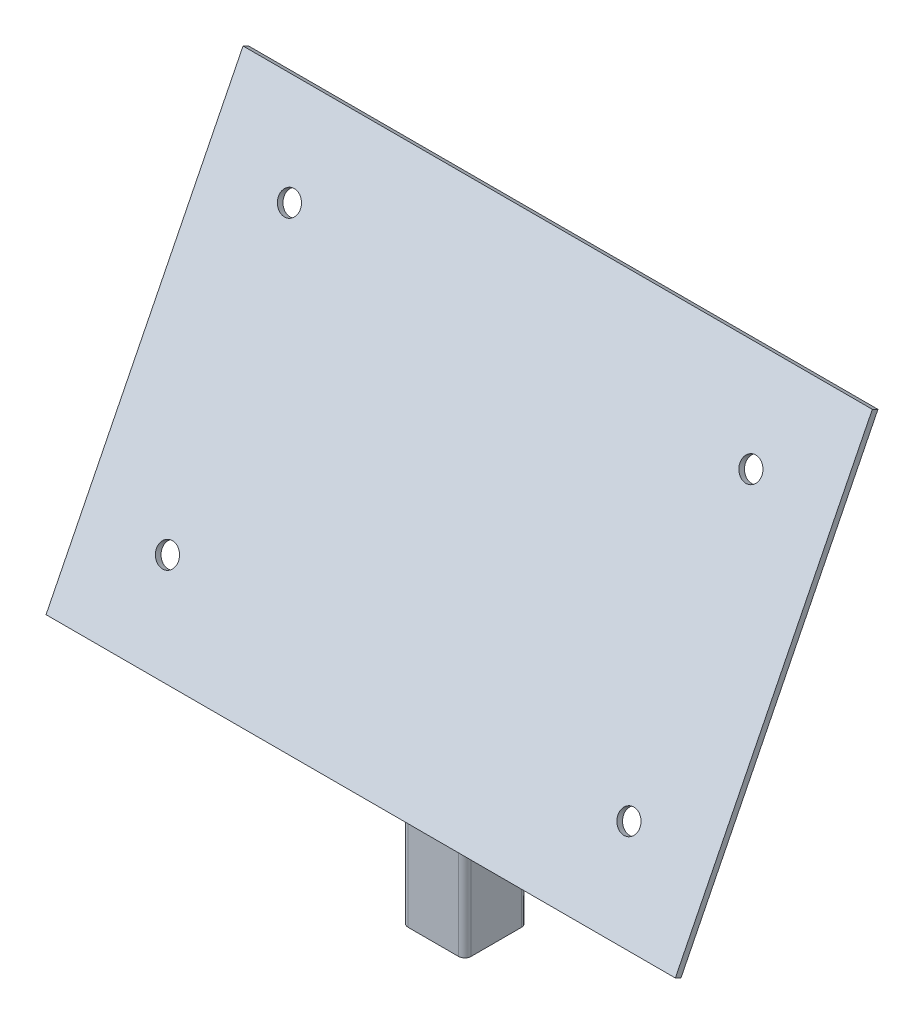
ISO-10303-21;
HEADER;
FILE_DESCRIPTION(('STEP AP214'),'2;1');
FILE_NAME('part.step','',(''),(''),'','','');
FILE_SCHEMA(('AUTOMOTIVE_DESIGN { 1 0 10303 214 1 1 1 1 }'));
ENDSEC;
DATA;
#1=APPLICATION_CONTEXT('core data for automotive mechanical design processes');
#2=APPLICATION_PROTOCOL_DEFINITION('international standard','automotive_design',2000,#1);
#3=PRODUCT_CONTEXT('',#1,'mechanical');
#4=PRODUCT('Part','Part','',(#3));
#5=PRODUCT_RELATED_PRODUCT_CATEGORY('part','',(#4));
#6=PRODUCT_DEFINITION_FORMATION('','',#4);
#7=PRODUCT_DEFINITION_CONTEXT('part definition',#1,'design');
#8=PRODUCT_DEFINITION('design','',#6,#7);
#9=PRODUCT_DEFINITION_SHAPE('','',#8);
#10=(LENGTH_UNIT() NAMED_UNIT(*) SI_UNIT(.MILLI.,.METRE.));
#11=(NAMED_UNIT(*) PLANE_ANGLE_UNIT() SI_UNIT($,.RADIAN.));
#12=(NAMED_UNIT(*) SI_UNIT($,.STERADIAN.) SOLID_ANGLE_UNIT());
#13=UNCERTAINTY_MEASURE_WITH_UNIT(LENGTH_MEASURE(1.E-05),#10,'distance_accuracy_value','');
#14=(GEOMETRIC_REPRESENTATION_CONTEXT(3) GLOBAL_UNCERTAINTY_ASSIGNED_CONTEXT((#13)) GLOBAL_UNIT_ASSIGNED_CONTEXT((#10,
#11,#12)) REPRESENTATION_CONTEXT('',''));
#15=CARTESIAN_POINT('',(0.,0.,0.));
#16=DIRECTION('',(0.,0.,1.));
#17=DIRECTION('',(1.,0.,0.));
#18=AXIS2_PLACEMENT_3D('',#15,#16,#17);
#19=CARTESIAN_POINT('',(12.,0.,12.));
#20=DIRECTION('',(0.,1.,0.));
#21=DIRECTION('',(0.,0.,1.));
#22=AXIS2_PLACEMENT_3D('',#19,#20,#21);
#23=PLANE('',#22);
#24=CARTESIAN_POINT('',(12.,0.,12.));
#25=DIRECTION('',(0.,1.,0.));
#26=DIRECTION('',(0.,0.,1.));
#27=AXIS2_PLACEMENT_3D('',#24,#25,#26);
#28=CIRCLE('',#27,3.);
#29=CARTESIAN_POINT('',(12.,0.,15.));
#30=VERTEX_POINT('',#29);
#31=CARTESIAN_POINT('',(15.,0.,12.));
#32=VERTEX_POINT('',#31);
#33=EDGE_CURVE('E276',#30,#32,#28,.T.);
#34=ORIENTED_EDGE('',*,*,#33,.F.);
#35=DIRECTION('',(1.,0.,0.));
#36=VECTOR('',#35,1.);
#37=CARTESIAN_POINT('',(-12.,0.,15.));
#38=LINE('',#37,#36);
#39=CARTESIAN_POINT('',(-12.,0.,15.));
#40=VERTEX_POINT('',#39);
#41=EDGE_CURVE('E281',#40,#30,#38,.T.);
#42=ORIENTED_EDGE('',*,*,#41,.F.);
#43=CARTESIAN_POINT('',(-12.,0.,12.));
#44=DIRECTION('',(0.,1.,0.));
#45=DIRECTION('',(0.,0.,-1.));
#46=AXIS2_PLACEMENT_3D('',#43,#44,#45);
#47=CIRCLE('',#46,3.);
#48=CARTESIAN_POINT('',(-15.,0.,12.));
#49=VERTEX_POINT('',#48);
#50=EDGE_CURVE('E297',#49,#40,#47,.T.);
#51=ORIENTED_EDGE('',*,*,#50,.F.);
#52=DIRECTION('',(0.,0.,1.));
#53=VECTOR('',#52,1.);
#54=CARTESIAN_POINT('',(-15.,0.,12.));
#55=LINE('',#54,#53);
#56=CARTESIAN_POINT('',(-15.,0.,-12.));
#57=VERTEX_POINT('',#56);
#58=EDGE_CURVE('E294',#57,#49,#55,.T.);
#59=ORIENTED_EDGE('',*,*,#58,.F.);
#60=CARTESIAN_POINT('',(-12.,0.,-12.));
#61=DIRECTION('',(0.,1.,0.));
#62=DIRECTION('',(0.,0.,-1.));
#63=AXIS2_PLACEMENT_3D('',#60,#61,#62);
#64=CIRCLE('',#63,3.);
#65=CARTESIAN_POINT('',(-12.,0.,-15.));
#66=VERTEX_POINT('',#65);
#67=EDGE_CURVE('E291',#66,#57,#64,.T.);
#68=ORIENTED_EDGE('',*,*,#67,.F.);
#69=DIRECTION('',(-1.,0.,0.));
#70=VECTOR('',#69,1.);
#71=CARTESIAN_POINT('',(-12.,0.,-15.));
#72=LINE('',#71,#70);
#73=CARTESIAN_POINT('',(12.,0.,-15.));
#74=VERTEX_POINT('',#73);
#75=EDGE_CURVE('E289',#74,#66,#72,.T.);
#76=ORIENTED_EDGE('',*,*,#75,.F.);
#77=CARTESIAN_POINT('',(12.,0.,-12.));
#78=DIRECTION('',(0.,1.,0.));
#79=DIRECTION('',(0.,0.,-1.));
#80=AXIS2_PLACEMENT_3D('',#77,#78,#79);
#81=CIRCLE('',#80,3.);
#82=CARTESIAN_POINT('',(15.,0.,-12.));
#83=VERTEX_POINT('',#82);
#84=EDGE_CURVE('E287',#83,#74,#81,.T.);
#85=ORIENTED_EDGE('',*,*,#84,.F.);
#86=DIRECTION('',(0.,0.,-1.));
#87=VECTOR('',#86,1.);
#88=CARTESIAN_POINT('',(15.,0.,12.));
#89=LINE('',#88,#87);
#90=EDGE_CURVE('E284',#32,#83,#89,.T.);
#91=ORIENTED_EDGE('',*,*,#90,.F.);
#92=EDGE_LOOP('',(#34,#42,#51,#59,#68,#76,#85,#91));
#93=FACE_BOUND('',#92,.T.);
#94=CARTESIAN_POINT('',(10.,0.,10.));
#95=DIRECTION('',(0.,1.,0.));
#96=DIRECTION('',(0.,0.,1.));
#97=AXIS2_PLACEMENT_3D('',#94,#95,#96);
#98=CIRCLE('',#97,3.);
#99=CARTESIAN_POINT('',(9.99999999999998,0.,13.));
#100=VERTEX_POINT('',#99);
#101=CARTESIAN_POINT('',(13.,0.,9.99999999999998));
#102=VERTEX_POINT('',#101);
#103=EDGE_CURVE('E236',#100,#102,#98,.T.);
#104=ORIENTED_EDGE('',*,*,#103,.T.);
#105=DIRECTION('',(0.,0.,-1.));
#106=VECTOR('',#105,1.);
#107=CARTESIAN_POINT('',(13.,0.,9.99999999999998));
#108=LINE('',#107,#106);
#109=CARTESIAN_POINT('',(13.,0.,-9.99999999999998));
#110=VERTEX_POINT('',#109);
#111=EDGE_CURVE('E239',#102,#110,#108,.T.);
#112=ORIENTED_EDGE('',*,*,#111,.T.);
#113=CARTESIAN_POINT('',(10.,0.,-10.));
#114=DIRECTION('',(0.,1.,0.));
#115=DIRECTION('',(0.,0.,-1.));
#116=AXIS2_PLACEMENT_3D('',#113,#114,#115);
#117=CIRCLE('',#116,3.);
#118=CARTESIAN_POINT('',(9.99999999999998,0.,-13.));
#119=VERTEX_POINT('',#118);
#120=EDGE_CURVE('E242',#110,#119,#117,.T.);
#121=ORIENTED_EDGE('',*,*,#120,.T.);
#122=DIRECTION('',(-1.,0.,0.));
#123=VECTOR('',#122,1.);
#124=CARTESIAN_POINT('',(-9.99999999999998,0.,-13.));
#125=LINE('',#124,#123);
#126=CARTESIAN_POINT('',(-10.,0.,-13.));
#127=VERTEX_POINT('',#126);
#128=EDGE_CURVE('E245',#119,#127,#125,.T.);
#129=ORIENTED_EDGE('',*,*,#128,.T.);
#130=CARTESIAN_POINT('',(-10.,0.,-10.));
#131=DIRECTION('',(0.,1.,0.));
#132=DIRECTION('',(0.,0.,-1.));
#133=AXIS2_PLACEMENT_3D('',#130,#131,#132);
#134=CIRCLE('',#133,3.);
#135=CARTESIAN_POINT('',(-13.,0.,-9.99999999999998));
#136=VERTEX_POINT('',#135);
#137=EDGE_CURVE('E248',#127,#136,#134,.T.);
#138=ORIENTED_EDGE('',*,*,#137,.T.);
#139=DIRECTION('',(0.,0.,1.));
#140=VECTOR('',#139,1.);
#141=CARTESIAN_POINT('',(-13.,0.,9.99999999999998));
#142=LINE('',#141,#140);
#143=CARTESIAN_POINT('',(-13.,0.,9.99999999999998));
#144=VERTEX_POINT('',#143);
#145=EDGE_CURVE('E251',#136,#144,#142,.T.);
#146=ORIENTED_EDGE('',*,*,#145,.T.);
#147=CARTESIAN_POINT('',(-10.,0.,10.));
#148=DIRECTION('',(0.,1.,0.));
#149=DIRECTION('',(0.,0.,-1.));
#150=AXIS2_PLACEMENT_3D('',#147,#148,#149);
#151=CIRCLE('',#150,3.);
#152=CARTESIAN_POINT('',(-9.99999999999998,0.,13.));
#153=VERTEX_POINT('',#152);
#154=EDGE_CURVE('E254',#144,#153,#151,.T.);
#155=ORIENTED_EDGE('',*,*,#154,.T.);
#156=DIRECTION('',(1.,0.,0.));
#157=VECTOR('',#156,1.);
#158=CARTESIAN_POINT('',(-9.99999999999998,0.,13.));
#159=LINE('',#158,#157);
#160=EDGE_CURVE('E257',#153,#100,#159,.T.);
#161=ORIENTED_EDGE('',*,*,#160,.T.);
#162=EDGE_LOOP('',(#104,#112,#121,#129,#138,#146,#155,#161));
#163=FACE_BOUND('',#162,.T.);
#164=ADVANCED_FACE('F33',(#93,#163),#23,.F.);
#165=CARTESIAN_POINT('',(12.,200.,12.));
#166=DIRECTION('',(0.,-1.,0.));
#167=DIRECTION('',(0.,0.,-1.));
#168=AXIS2_PLACEMENT_3D('',#165,#166,#167);
#169=CYLINDRICAL_SURFACE('',#168,3.);
#170=DIRECTION('',(0.,-1.,0.));
#171=VECTOR('',#170,1.);
#172=CARTESIAN_POINT('',(15.,200.,12.));
#173=LINE('',#172,#171);
#174=CARTESIAN_POINT('',(15.,146.,12.));
#175=VERTEX_POINT('',#174);
#176=EDGE_CURVE('E42',#175,#32,#173,.T.);
#177=ORIENTED_EDGE('',*,*,#176,.F.);
#178=CARTESIAN_POINT('',(12.,146.,12.));
#179=DIRECTION('',(0.,-0.447213595499958,-0.894427190999916));
#180=DIRECTION('',(0.,-0.894427190999916,0.447213595499958));
#181=AXIS2_PLACEMENT_3D('',#178,#179,#180);
#182=ELLIPSE('',#181,6.70820393249937,3.);
#183=CARTESIAN_POINT('',(12.,140.,15.));
#184=VERTEX_POINT('',#183);
#185=EDGE_CURVE('E233',#175,#184,#182,.T.);
#186=ORIENTED_EDGE('',*,*,#185,.T.);
#187=DIRECTION('',(0.,-1.,0.));
#188=VECTOR('',#187,1.);
#189=CARTESIAN_POINT('',(12.,200.,15.));
#190=LINE('',#189,#188);
#191=EDGE_CURVE('E280',#184,#30,#190,.T.);
#192=ORIENTED_EDGE('',*,*,#191,.T.);
#193=ORIENTED_EDGE('',*,*,#33,.T.);
#194=EDGE_LOOP('',(#177,#186,#192,#193));
#195=FACE_BOUND('',#194,.T.);
#196=ADVANCED_FACE('F35',(#195),#169,.T.);
#197=CARTESIAN_POINT('',(15.,200.,12.));
#198=DIRECTION('',(-1.,0.,0.));
#199=DIRECTION('',(0.,0.,1.));
#200=AXIS2_PLACEMENT_3D('',#197,#198,#199);
#201=PLANE('',#200);
#202=DIRECTION('',(0.,-1.,0.));
#203=VECTOR('',#202,1.);
#204=CARTESIAN_POINT('',(15.,200.,-12.));
#205=LINE('',#204,#203);
#206=CARTESIAN_POINT('',(15.,194.,-12.));
#207=VERTEX_POINT('',#206);
#208=EDGE_CURVE('E315',#207,#83,#205,.T.);
#209=ORIENTED_EDGE('',*,*,#208,.F.);
#210=DIRECTION('',(0.,0.894427190999916,-0.447213595499958));
#211=VECTOR('',#210,1.);
#212=CARTESIAN_POINT('',(15.,200.,-15.));
#213=LINE('',#212,#211);
#214=EDGE_CURVE('E195',#175,#207,#213,.T.);
#215=ORIENTED_EDGE('',*,*,#214,.F.);
#216=ORIENTED_EDGE('',*,*,#176,.T.);
#217=ORIENTED_EDGE('',*,*,#90,.T.);
#218=EDGE_LOOP('',(#209,#215,#216,#217));
#219=FACE_BOUND('',#218,.T.);
#220=ADVANCED_FACE('F375',(#219),#201,.F.);
#221=CARTESIAN_POINT('',(12.,200.,-12.));
#222=DIRECTION('',(0.,-1.,0.));
#223=DIRECTION('',(0.,0.,-1.));
#224=AXIS2_PLACEMENT_3D('',#221,#222,#223);
#225=CYLINDRICAL_SURFACE('',#224,3.);
#226=DIRECTION('',(0.,-1.,0.));
#227=VECTOR('',#226,1.);
#228=CARTESIAN_POINT('',(12.,200.,-15.));
#229=LINE('',#228,#227);
#230=CARTESIAN_POINT('',(12.,200.,-15.));
#231=VERTEX_POINT('',#230);
#232=EDGE_CURVE('E312',#231,#74,#229,.T.);
#233=ORIENTED_EDGE('',*,*,#232,.F.);
#234=CARTESIAN_POINT('',(12.,194.,-12.));
#235=DIRECTION('',(0.,-0.447213595499958,-0.894427190999916));
#236=DIRECTION('',(0.,-0.894427190999916,0.447213595499958));
#237=AXIS2_PLACEMENT_3D('',#234,#235,#236);
#238=ELLIPSE('',#237,6.70820393249937,3.);
#239=EDGE_CURVE('E231',#231,#207,#238,.T.);
#240=ORIENTED_EDGE('',*,*,#239,.T.);
#241=ORIENTED_EDGE('',*,*,#208,.T.);
#242=ORIENTED_EDGE('',*,*,#84,.T.);
#243=EDGE_LOOP('',(#233,#240,#241,#242));
#244=FACE_BOUND('',#243,.T.);
#245=ADVANCED_FACE('F401',(#244),#225,.T.);
#246=CARTESIAN_POINT('',(-12.,200.,-15.));
#247=DIRECTION('',(0.,0.,1.));
#248=DIRECTION('',(1.,0.,0.));
#249=AXIS2_PLACEMENT_3D('',#246,#247,#248);
#250=PLANE('',#249);
#251=ORIENTED_EDGE('',*,*,#75,.T.);
#252=DIRECTION('',(0.,-1.,0.));
#253=VECTOR('',#252,1.);
#254=CARTESIAN_POINT('',(-12.,200.,-15.));
#255=LINE('',#254,#253);
#256=CARTESIAN_POINT('',(-12.,200.,-15.));
#257=VERTEX_POINT('',#256);
#258=EDGE_CURVE('E309',#257,#66,#255,.T.);
#259=ORIENTED_EDGE('',*,*,#258,.F.);
#260=DIRECTION('',(-1.,0.,0.));
#261=VECTOR('',#260,1.);
#262=CARTESIAN_POINT('',(-12.,200.,-15.));
#263=LINE('',#262,#261);
#264=EDGE_CURVE('E277',#231,#257,#263,.T.);
#265=ORIENTED_EDGE('',*,*,#264,.F.);
#266=ORIENTED_EDGE('',*,*,#232,.T.);
#267=EDGE_LOOP('',(#251,#259,#265,#266));
#268=FACE_BOUND('',#267,.T.);
#269=ADVANCED_FACE('F397',(#268),#250,.F.);
#270=CARTESIAN_POINT('',(-12.,200.,-12.));
#271=DIRECTION('',(0.,-1.,0.));
#272=DIRECTION('',(0.,0.,-1.));
#273=AXIS2_PLACEMENT_3D('',#270,#271,#272);
#274=CYLINDRICAL_SURFACE('',#273,3.);
#275=DIRECTION('',(0.,-1.,0.));
#276=VECTOR('',#275,1.);
#277=CARTESIAN_POINT('',(-15.,200.,-12.));
#278=LINE('',#277,#276);
#279=CARTESIAN_POINT('',(-15.,194.,-12.));
#280=VERTEX_POINT('',#279);
#281=EDGE_CURVE('E307',#280,#57,#278,.T.);
#282=ORIENTED_EDGE('',*,*,#281,.F.);
#283=CARTESIAN_POINT('',(-12.,194.,-12.));
#284=DIRECTION('',(0.,-0.447213595499958,-0.894427190999916));
#285=DIRECTION('',(0.,-0.894427190999916,0.447213595499958));
#286=AXIS2_PLACEMENT_3D('',#283,#284,#285);
#287=ELLIPSE('',#286,6.70820393249937,3.);
#288=EDGE_CURVE('E229',#280,#257,#287,.T.);
#289=ORIENTED_EDGE('',*,*,#288,.T.);
#290=ORIENTED_EDGE('',*,*,#258,.T.);
#291=ORIENTED_EDGE('',*,*,#67,.T.);
#292=EDGE_LOOP('',(#282,#289,#290,#291));
#293=FACE_BOUND('',#292,.T.);
#294=ADVANCED_FACE('F393',(#293),#274,.T.);
#295=CARTESIAN_POINT('',(-15.,200.,12.));
#296=DIRECTION('',(1.,0.,0.));
#297=DIRECTION('',(0.,0.,-1.));
#298=AXIS2_PLACEMENT_3D('',#295,#296,#297);
#299=PLANE('',#298);
#300=DIRECTION('',(0.,-1.,0.));
#301=VECTOR('',#300,1.);
#302=CARTESIAN_POINT('',(-15.,200.,12.));
#303=LINE('',#302,#301);
#304=CARTESIAN_POINT('',(-15.,146.,12.));
#305=VERTEX_POINT('',#304);
#306=EDGE_CURVE('E305',#305,#49,#303,.T.);
#307=ORIENTED_EDGE('',*,*,#306,.F.);
#308=DIRECTION('',(0.,0.894427190999916,-0.447213595499958));
#309=VECTOR('',#308,1.);
#310=CARTESIAN_POINT('',(-15.,189.2,-9.6));
#311=LINE('',#310,#309);
#312=EDGE_CURVE('E227',#305,#280,#311,.T.);
#313=ORIENTED_EDGE('',*,*,#312,.T.);
#314=ORIENTED_EDGE('',*,*,#281,.T.);
#315=ORIENTED_EDGE('',*,*,#58,.T.);
#316=EDGE_LOOP('',(#307,#313,#314,#315));
#317=FACE_BOUND('',#316,.T.);
#318=ADVANCED_FACE('F389',(#317),#299,.F.);
#319=CARTESIAN_POINT('',(-12.,200.,12.));
#320=DIRECTION('',(0.,-1.,0.));
#321=DIRECTION('',(0.,0.,-1.));
#322=AXIS2_PLACEMENT_3D('',#319,#320,#321);
#323=CYLINDRICAL_SURFACE('',#322,3.);
#324=DIRECTION('',(0.,-1.,0.));
#325=VECTOR('',#324,1.);
#326=CARTESIAN_POINT('',(-12.,200.,15.));
#327=LINE('',#326,#325);
#328=CARTESIAN_POINT('',(-12.,140.,15.));
#329=VERTEX_POINT('',#328);
#330=EDGE_CURVE('E303',#329,#40,#327,.T.);
#331=ORIENTED_EDGE('',*,*,#330,.F.);
#332=CARTESIAN_POINT('',(-12.,146.,12.));
#333=DIRECTION('',(0.,-0.447213595499958,-0.894427190999916));
#334=DIRECTION('',(0.,-0.894427190999916,0.447213595499958));
#335=AXIS2_PLACEMENT_3D('',#332,#333,#334);
#336=ELLIPSE('',#335,6.70820393249937,3.);
#337=EDGE_CURVE('E225',#329,#305,#336,.T.);
#338=ORIENTED_EDGE('',*,*,#337,.T.);
#339=ORIENTED_EDGE('',*,*,#306,.T.);
#340=ORIENTED_EDGE('',*,*,#50,.T.);
#341=EDGE_LOOP('',(#331,#338,#339,#340));
#342=FACE_BOUND('',#341,.T.);
#343=ADVANCED_FACE('F386',(#342),#323,.T.);
#344=CARTESIAN_POINT('',(-12.,200.,15.));
#345=DIRECTION('',(0.,0.,-1.));
#346=DIRECTION('',(-1.,0.,0.));
#347=AXIS2_PLACEMENT_3D('',#344,#345,#346);
#348=PLANE('',#347);
#349=ORIENTED_EDGE('',*,*,#191,.F.);
#350=DIRECTION('',(1.,0.,0.));
#351=VECTOR('',#350,1.);
#352=CARTESIAN_POINT('',(-85.,140.,15.));
#353=LINE('',#352,#351);
#354=EDGE_CURVE('E50',#329,#184,#353,.T.);
#355=ORIENTED_EDGE('',*,*,#354,.F.);
#356=ORIENTED_EDGE('',*,*,#330,.T.);
#357=ORIENTED_EDGE('',*,*,#41,.T.);
#358=EDGE_LOOP('',(#349,#355,#356,#357));
#359=FACE_BOUND('',#358,.T.);
#360=ADVANCED_FACE('F383',(#359),#348,.F.);
#361=CARTESIAN_POINT('',(10.,200.,10.));
#362=DIRECTION('',(0.,-1.,0.));
#363=DIRECTION('',(0.,0.,-1.));
#364=AXIS2_PLACEMENT_3D('',#361,#362,#363);
#365=CYLINDRICAL_SURFACE('',#364,3.);
#366=CARTESIAN_POINT('',(10.,150.,10.));
#367=DIRECTION('',(0.,-0.447213595499958,-0.894427190999916));
#368=DIRECTION('',(0.,-0.894427190999916,0.447213595499958));
#369=AXIS2_PLACEMENT_3D('',#366,#367,#368);
#370=ELLIPSE('',#369,6.70820393249937,3.);
#371=CARTESIAN_POINT('',(13.,150.,9.99999999999998));
#372=VERTEX_POINT('',#371);
#373=CARTESIAN_POINT('',(9.99999999999998,144.,13.));
#374=VERTEX_POINT('',#373);
#375=EDGE_CURVE('E222',#372,#374,#370,.T.);
#376=ORIENTED_EDGE('',*,*,#375,.F.);
#377=DIRECTION('',(0.,-1.,0.));
#378=VECTOR('',#377,1.);
#379=CARTESIAN_POINT('',(13.,200.,9.99999999999998));
#380=LINE('',#379,#378);
#381=EDGE_CURVE('E274',#372,#102,#380,.T.);
#382=ORIENTED_EDGE('',*,*,#381,.T.);
#383=ORIENTED_EDGE('',*,*,#103,.F.);
#384=DIRECTION('',(0.,-1.,0.));
#385=VECTOR('',#384,1.);
#386=CARTESIAN_POINT('',(9.99999999999998,200.,13.));
#387=LINE('',#386,#385);
#388=EDGE_CURVE('E260',#374,#100,#387,.T.);
#389=ORIENTED_EDGE('',*,*,#388,.F.);
#390=EDGE_LOOP('',(#376,#382,#383,#389));
#391=FACE_BOUND('',#390,.T.);
#392=ADVANCED_FACE('F381',(#391),#365,.F.);
#393=CARTESIAN_POINT('',(13.,200.,9.99999999999998));
#394=DIRECTION('',(-1.,0.,0.));
#395=DIRECTION('',(0.,0.,1.));
#396=AXIS2_PLACEMENT_3D('',#393,#394,#395);
#397=PLANE('',#396);
#398=DIRECTION('',(0.,-0.894427190999916,0.447213595499958));
#399=VECTOR('',#398,1.);
#400=CARTESIAN_POINT('',(13.,190.,-10.));
#401=LINE('',#400,#399);
#402=CARTESIAN_POINT('',(13.,190.,-9.99999999999998));
#403=VERTEX_POINT('',#402);
#404=EDGE_CURVE('E219',#403,#372,#401,.T.);
#405=ORIENTED_EDGE('',*,*,#404,.F.);
#406=DIRECTION('',(0.,-1.,0.));
#407=VECTOR('',#406,1.);
#408=CARTESIAN_POINT('',(13.,200.,-9.99999999999998));
#409=LINE('',#408,#407);
#410=EDGE_CURVE('E272',#403,#110,#409,.T.);
#411=ORIENTED_EDGE('',*,*,#410,.T.);
#412=ORIENTED_EDGE('',*,*,#111,.F.);
#413=ORIENTED_EDGE('',*,*,#381,.F.);
#414=EDGE_LOOP('',(#405,#411,#412,#413));
#415=FACE_BOUND('',#414,.T.);
#416=ADVANCED_FACE('F571',(#415),#397,.T.);
#417=CARTESIAN_POINT('',(10.,200.,-10.));
#418=DIRECTION('',(0.,-1.,0.));
#419=DIRECTION('',(0.,0.,-1.));
#420=AXIS2_PLACEMENT_3D('',#417,#418,#419);
#421=CYLINDRICAL_SURFACE('',#420,3.);
#422=CARTESIAN_POINT('',(10.,190.,-10.));
#423=DIRECTION('',(0.,-0.447213595499958,-0.894427190999916));
#424=DIRECTION('',(0.,-0.894427190999916,0.447213595499958));
#425=AXIS2_PLACEMENT_3D('',#422,#423,#424);
#426=ELLIPSE('',#425,6.70820393249937,3.);
#427=CARTESIAN_POINT('',(9.99999999999997,196.,-13.));
#428=VERTEX_POINT('',#427);
#429=EDGE_CURVE('E216',#428,#403,#426,.T.);
#430=ORIENTED_EDGE('',*,*,#429,.F.);
#431=DIRECTION('',(0.,-1.,0.));
#432=VECTOR('',#431,1.);
#433=CARTESIAN_POINT('',(9.99999999999998,200.,-13.));
#434=LINE('',#433,#432);
#435=EDGE_CURVE('E270',#428,#119,#434,.T.);
#436=ORIENTED_EDGE('',*,*,#435,.T.);
#437=ORIENTED_EDGE('',*,*,#120,.F.);
#438=ORIENTED_EDGE('',*,*,#410,.F.);
#439=EDGE_LOOP('',(#430,#436,#437,#438));
#440=FACE_BOUND('',#439,.T.);
#441=ADVANCED_FACE('F562',(#440),#421,.F.);
#442=CARTESIAN_POINT('',(-9.99999999999998,200.,-13.));
#443=DIRECTION('',(0.,0.,1.));
#444=DIRECTION('',(1.,0.,0.));
#445=AXIS2_PLACEMENT_3D('',#442,#443,#444);
#446=PLANE('',#445);
#447=DIRECTION('',(1.,0.,0.));
#448=VECTOR('',#447,1.);
#449=CARTESIAN_POINT('',(-9.99999999999998,196.,-13.));
#450=LINE('',#449,#448);
#451=CARTESIAN_POINT('',(-10.,196.,-13.));
#452=VERTEX_POINT('',#451);
#453=EDGE_CURVE('E213',#452,#428,#450,.T.);
#454=ORIENTED_EDGE('',*,*,#453,.F.);
#455=DIRECTION('',(0.,-1.,0.));
#456=VECTOR('',#455,1.);
#457=CARTESIAN_POINT('',(-10.,200.,-13.));
#458=LINE('',#457,#456);
#459=EDGE_CURVE('E268',#452,#127,#458,.T.);
#460=ORIENTED_EDGE('',*,*,#459,.T.);
#461=ORIENTED_EDGE('',*,*,#128,.F.);
#462=ORIENTED_EDGE('',*,*,#435,.F.);
#463=EDGE_LOOP('',(#454,#460,#461,#462));
#464=FACE_BOUND('',#463,.T.);
#465=ADVANCED_FACE('F553',(#464),#446,.T.);
#466=CARTESIAN_POINT('',(-10.,200.,-10.));
#467=DIRECTION('',(0.,-1.,0.));
#468=DIRECTION('',(0.,0.,-1.));
#469=AXIS2_PLACEMENT_3D('',#466,#467,#468);
#470=CYLINDRICAL_SURFACE('',#469,3.);
#471=CARTESIAN_POINT('',(-10.,190.,-10.));
#472=DIRECTION('',(0.,-0.447213595499958,-0.894427190999916));
#473=DIRECTION('',(0.,-0.894427190999916,0.447213595499958));
#474=AXIS2_PLACEMENT_3D('',#471,#472,#473);
#475=ELLIPSE('',#474,6.70820393249937,3.);
#476=CARTESIAN_POINT('',(-13.,190.,-9.99999999999998));
#477=VERTEX_POINT('',#476);
#478=EDGE_CURVE('E210',#477,#452,#475,.T.);
#479=ORIENTED_EDGE('',*,*,#478,.F.);
#480=DIRECTION('',(0.,-1.,0.));
#481=VECTOR('',#480,1.);
#482=CARTESIAN_POINT('',(-13.,200.,-9.99999999999998));
#483=LINE('',#482,#481);
#484=EDGE_CURVE('E266',#477,#136,#483,.T.);
#485=ORIENTED_EDGE('',*,*,#484,.T.);
#486=ORIENTED_EDGE('',*,*,#137,.F.);
#487=ORIENTED_EDGE('',*,*,#459,.F.);
#488=EDGE_LOOP('',(#479,#485,#486,#487));
#489=FACE_BOUND('',#488,.T.);
#490=ADVANCED_FACE('F544',(#489),#470,.F.);
#491=CARTESIAN_POINT('',(-13.,200.,9.99999999999998));
#492=DIRECTION('',(1.,0.,0.));
#493=DIRECTION('',(0.,0.,-1.));
#494=AXIS2_PLACEMENT_3D('',#491,#492,#493);
#495=PLANE('',#494);
#496=DIRECTION('',(0.,0.894427190999916,-0.447213595499958));
#497=VECTOR('',#496,1.);
#498=CARTESIAN_POINT('',(-13.,190.,-10.));
#499=LINE('',#498,#497);
#500=CARTESIAN_POINT('',(-13.,150.,9.99999999999998));
#501=VERTEX_POINT('',#500);
#502=EDGE_CURVE('E207',#501,#477,#499,.T.);
#503=ORIENTED_EDGE('',*,*,#502,.F.);
#504=DIRECTION('',(0.,-1.,0.));
#505=VECTOR('',#504,1.);
#506=CARTESIAN_POINT('',(-13.,200.,9.99999999999998));
#507=LINE('',#506,#505);
#508=EDGE_CURVE('E264',#501,#144,#507,.T.);
#509=ORIENTED_EDGE('',*,*,#508,.T.);
#510=ORIENTED_EDGE('',*,*,#145,.F.);
#511=ORIENTED_EDGE('',*,*,#484,.F.);
#512=EDGE_LOOP('',(#503,#509,#510,#511));
#513=FACE_BOUND('',#512,.T.);
#514=ADVANCED_FACE('F535',(#513),#495,.T.);
#515=CARTESIAN_POINT('',(-10.,200.,10.));
#516=DIRECTION('',(0.,-1.,0.));
#517=DIRECTION('',(0.,0.,-1.));
#518=AXIS2_PLACEMENT_3D('',#515,#516,#517);
#519=CYLINDRICAL_SURFACE('',#518,3.);
#520=CARTESIAN_POINT('',(-10.,150.,10.));
#521=DIRECTION('',(0.,-0.447213595499958,-0.894427190999916));
#522=DIRECTION('',(0.,-0.894427190999916,0.447213595499958));
#523=AXIS2_PLACEMENT_3D('',#520,#521,#522);
#524=ELLIPSE('',#523,6.70820393249937,3.);
#525=CARTESIAN_POINT('',(-9.99999999999998,144.,13.));
#526=VERTEX_POINT('',#525);
#527=EDGE_CURVE('E204',#526,#501,#524,.T.);
#528=ORIENTED_EDGE('',*,*,#527,.F.);
#529=DIRECTION('',(0.,-1.,0.));
#530=VECTOR('',#529,1.);
#531=CARTESIAN_POINT('',(-9.99999999999998,200.,13.));
#532=LINE('',#531,#530);
#533=EDGE_CURVE('E262',#526,#153,#532,.T.);
#534=ORIENTED_EDGE('',*,*,#533,.T.);
#535=ORIENTED_EDGE('',*,*,#154,.F.);
#536=ORIENTED_EDGE('',*,*,#508,.F.);
#537=EDGE_LOOP('',(#528,#534,#535,#536));
#538=FACE_BOUND('',#537,.T.);
#539=ADVANCED_FACE('F527',(#538),#519,.F.);
#540=CARTESIAN_POINT('',(-9.99999999999998,200.,13.));
#541=DIRECTION('',(0.,0.,-1.));
#542=DIRECTION('',(-1.,0.,0.));
#543=AXIS2_PLACEMENT_3D('',#540,#541,#542);
#544=PLANE('',#543);
#545=DIRECTION('',(-1.,0.,0.));
#546=VECTOR('',#545,1.);
#547=CARTESIAN_POINT('',(-9.99999999999998,144.,13.));
#548=LINE('',#547,#546);
#549=EDGE_CURVE('E11',#374,#526,#548,.T.);
#550=ORIENTED_EDGE('',*,*,#549,.F.);
#551=ORIENTED_EDGE('',*,*,#388,.T.);
#552=ORIENTED_EDGE('',*,*,#160,.F.);
#553=ORIENTED_EDGE('',*,*,#533,.F.);
#554=EDGE_LOOP('',(#550,#551,#552,#553));
#555=FACE_BOUND('',#554,.T.);
#556=ADVANCED_FACE('F436',(#555),#544,.T.);
#557=CARTESIAN_POINT('',(0.,34.,68.));
#558=DIRECTION('',(0.,-0.447213595499958,-0.894427190999916));
#559=DIRECTION('',(0.,0.894427190999916,-0.447213595499958));
#560=AXIS2_PLACEMENT_3D('',#557,#558,#559);
#561=PLANE('',#560);
#562=ORIENTED_EDGE('',*,*,#404,.T.);
#563=ORIENTED_EDGE('',*,*,#375,.T.);
#564=ORIENTED_EDGE('',*,*,#549,.T.);
#565=ORIENTED_EDGE('',*,*,#527,.T.);
#566=ORIENTED_EDGE('',*,*,#502,.T.);
#567=ORIENTED_EDGE('',*,*,#478,.T.);
#568=ORIENTED_EDGE('',*,*,#453,.T.);
#569=ORIENTED_EDGE('',*,*,#429,.T.);
#570=EDGE_LOOP('',(#562,#563,#564,#565,#566,#567,#568,#569));
#571=FACE_BOUND('',#570,.T.);
#572=ADVANCED_FACE('F428',(#571),#561,.T.);
#573=CARTESIAN_POINT('',(-110.,111.862232585006,29.0688837074972));
#574=DIRECTION('',(0.,-0.447213595499958,-0.894427190999916));
#575=DIRECTION('',(0.,0.894427190999916,-0.447213595499958));
#576=AXIS2_PLACEMENT_3D('',#573,#574,#575);
#577=CIRCLE('',#576,5.25);
#578=CARTESIAN_POINT('',(-110.,116.557975337755,26.7210123311225));
#579=VERTEX_POINT('',#578);
#580=EDGE_CURVE('E338',#579,#579,#577,.F.);
#581=ORIENTED_EDGE('',*,*,#580,.T.);
#582=EDGE_LOOP('',(#581));
#583=FACE_BOUND('',#582,.T.);
#584=CARTESIAN_POINT('',(110.,111.862232585006,29.0688837074972));
#585=DIRECTION('',(0.,-0.447213595499958,-0.894427190999916));
#586=DIRECTION('',(0.,0.894427190999916,-0.447213595499958));
#587=AXIS2_PLACEMENT_3D('',#584,#585,#586);
#588=CIRCLE('',#587,5.25);
#589=CARTESIAN_POINT('',(110.,116.557975337755,26.7210123311225));
#590=VERTEX_POINT('',#589);
#591=EDGE_CURVE('E327',#590,#590,#588,.F.);
#592=ORIENTED_EDGE('',*,*,#591,.T.);
#593=EDGE_LOOP('',(#592));
#594=FACE_BOUND('',#593,.T.);
#595=CARTESIAN_POINT('',(110.,228.137767414995,-29.0688837074973));
#596=DIRECTION('',(0.,-0.447213595499958,-0.894427190999916));
#597=DIRECTION('',(0.,0.894427190999916,-0.447213595499958));
#598=AXIS2_PLACEMENT_3D('',#595,#596,#597);
#599=CIRCLE('',#598,5.25000000000001);
#600=CARTESIAN_POINT('',(110.,232.833510167744,-31.4167550838721));
#601=VERTEX_POINT('',#600);
#602=EDGE_CURVE('E324',#601,#601,#599,.F.);
#603=ORIENTED_EDGE('',*,*,#602,.T.);
#604=EDGE_LOOP('',(#603));
#605=FACE_BOUND('',#604,.T.);
#606=CARTESIAN_POINT('',(-110.,228.137767414995,-29.0688837074973));
#607=DIRECTION('',(0.,-0.447213595499958,-0.894427190999916));
#608=DIRECTION('',(0.,0.894427190999916,-0.447213595499958));
#609=AXIS2_PLACEMENT_3D('',#606,#607,#608);
#610=CIRCLE('',#609,5.25000000000001);
#611=CARTESIAN_POINT('',(-110.,232.833510167744,-31.4167550838721));
#612=VERTEX_POINT('',#611);
#613=EDGE_CURVE('E321',#612,#612,#610,.F.);
#614=ORIENTED_EDGE('',*,*,#613,.T.);
#615=EDGE_LOOP('',(#614));
#616=FACE_BOUND('',#615,.T.);
#617=DIRECTION('',(0.,0.894427190999916,-0.447213595499958));
#618=VECTOR('',#617,1.);
#619=CARTESIAN_POINT('',(150.,76.0851449450088,46.9574275274956));
#620=LINE('',#619,#618);
#621=CARTESIAN_POINT('',(150.,76.0851449450088,46.9574275274956));
#622=VERTEX_POINT('',#621);
#623=CARTESIAN_POINT('',(150.,263.914855054991,-46.9574275274956));
#624=VERTEX_POINT('',#623);
#625=EDGE_CURVE('E194',#622,#624,#620,.T.);
#626=ORIENTED_EDGE('',*,*,#625,.F.);
#627=DIRECTION('',(1.,0.,0.));
#628=VECTOR('',#627,1.);
#629=CARTESIAN_POINT('',(-150.,76.0851449450088,46.9574275274956));
#630=LINE('',#629,#628);
#631=CARTESIAN_POINT('',(-150.,76.0851449450088,46.9574275274956));
#632=VERTEX_POINT('',#631);
#633=EDGE_CURVE('E190',#632,#622,#630,.T.);
#634=ORIENTED_EDGE('',*,*,#633,.F.);
#635=DIRECTION('',(0.,-0.894427190999916,0.447213595499958));
#636=VECTOR('',#635,1.);
#637=CARTESIAN_POINT('',(-150.,76.0851449450088,46.9574275274956));
#638=LINE('',#637,#636);
#639=CARTESIAN_POINT('',(-150.,263.914855054991,-46.9574275274956));
#640=VERTEX_POINT('',#639);
#641=EDGE_CURVE('E347',#640,#632,#638,.T.);
#642=ORIENTED_EDGE('',*,*,#641,.F.);
#643=DIRECTION('',(-1.,0.,0.));
#644=VECTOR('',#643,1.);
#645=CARTESIAN_POINT('',(-150.,263.914855054991,-46.9574275274956));
#646=LINE('',#645,#644);
#647=EDGE_CURVE('E345',#624,#640,#646,.T.);
#648=ORIENTED_EDGE('',*,*,#647,.F.);
#649=EDGE_LOOP('',(#626,#634,#642,#648));
#650=FACE_BOUND('',#649,.T.);
#651=ORIENTED_EDGE('',*,*,#185,.F.);
#652=ORIENTED_EDGE('',*,*,#214,.T.);
#653=ORIENTED_EDGE('',*,*,#239,.F.);
#654=ORIENTED_EDGE('',*,*,#264,.T.);
#655=ORIENTED_EDGE('',*,*,#288,.F.);
#656=ORIENTED_EDGE('',*,*,#312,.F.);
#657=ORIENTED_EDGE('',*,*,#337,.F.);
#658=ORIENTED_EDGE('',*,*,#354,.T.);
#659=EDGE_LOOP('',(#651,#652,#653,#654,#655,#656,#657,#658));
#660=FACE_BOUND('',#659,.T.);
#661=ADVANCED_FACE('F358',(#583,#594,#605,#616,#650,#660),#561,.T.);
#662=CARTESIAN_POINT('',(150.,77.4267857315087,49.6407091004953));
#663=DIRECTION('',(-1.,0.,0.));
#664=DIRECTION('',(0.,0.,1.));
#665=AXIS2_PLACEMENT_3D('',#662,#663,#664);
#666=PLANE('',#665);
#667=ORIENTED_EDGE('',*,*,#625,.T.);
#668=DIRECTION('',(0.,-0.447213595499958,-0.894427190999916));
#669=VECTOR('',#668,1.);
#670=CARTESIAN_POINT('',(150.,265.256495841491,-44.2741459544959));
#671=LINE('',#670,#669);
#672=CARTESIAN_POINT('',(150.,265.256495841491,-44.2741459544959));
#673=VERTEX_POINT('',#672);
#674=EDGE_CURVE('E174',#673,#624,#671,.T.);
#675=ORIENTED_EDGE('',*,*,#674,.F.);
#676=DIRECTION('',(0.,0.894427190999916,-0.447213595499958));
#677=VECTOR('',#676,1.);
#678=CARTESIAN_POINT('',(150.,77.4267857315087,49.6407091004953));
#679=LINE('',#678,#677);
#680=CARTESIAN_POINT('',(150.,77.4267857315087,49.6407091004953));
#681=VERTEX_POINT('',#680);
#682=EDGE_CURVE('E181',#681,#673,#679,.T.);
#683=ORIENTED_EDGE('',*,*,#682,.F.);
#684=DIRECTION('',(0.,-0.447213595499958,-0.894427190999916));
#685=VECTOR('',#684,1.);
#686=CARTESIAN_POINT('',(150.,77.4267857315087,49.6407091004953));
#687=LINE('',#686,#685);
#688=EDGE_CURVE('E343',#681,#622,#687,.T.);
#689=ORIENTED_EDGE('',*,*,#688,.T.);
#690=EDGE_LOOP('',(#667,#675,#683,#689));
#691=FACE_BOUND('',#690,.T.);
#692=ADVANCED_FACE('F192',(#691),#666,.F.);
#693=CARTESIAN_POINT('',(-150.,265.256495841491,-44.2741459544959));
#694=DIRECTION('',(0.,-0.894427190999916,0.447213595499958));
#695=DIRECTION('',(0.,-0.447213595499958,-0.894427190999916));
#696=AXIS2_PLACEMENT_3D('',#693,#694,#695);
#697=PLANE('',#696);
#698=ORIENTED_EDGE('',*,*,#647,.T.);
#699=DIRECTION('',(0.,-0.447213595499958,-0.894427190999916));
#700=VECTOR('',#699,1.);
#701=CARTESIAN_POINT('',(-150.,265.256495841491,-44.2741459544959));
#702=LINE('',#701,#700);
#703=CARTESIAN_POINT('',(-150.,265.256495841491,-44.2741459544959));
#704=VERTEX_POINT('',#703);
#705=EDGE_CURVE('E177',#704,#640,#702,.T.);
#706=ORIENTED_EDGE('',*,*,#705,.F.);
#707=DIRECTION('',(-1.,0.,0.));
#708=VECTOR('',#707,1.);
#709=CARTESIAN_POINT('',(-150.,265.256495841491,-44.2741459544959));
#710=LINE('',#709,#708);
#711=EDGE_CURVE('E170',#673,#704,#710,.T.);
#712=ORIENTED_EDGE('',*,*,#711,.F.);
#713=ORIENTED_EDGE('',*,*,#674,.T.);
#714=EDGE_LOOP('',(#698,#706,#712,#713));
#715=FACE_BOUND('',#714,.T.);
#716=ADVANCED_FACE('F172',(#715),#697,.F.);
#717=CARTESIAN_POINT('',(-150.,77.4267857315087,49.6407091004953));
#718=DIRECTION('',(1.,0.,0.));
#719=DIRECTION('',(0.,0.,-1.));
#720=AXIS2_PLACEMENT_3D('',#717,#718,#719);
#721=PLANE('',#720);
#722=ORIENTED_EDGE('',*,*,#641,.T.);
#723=DIRECTION('',(0.,-0.447213595499958,-0.894427190999916));
#724=VECTOR('',#723,1.);
#725=CARTESIAN_POINT('',(-150.,77.4267857315087,49.6407091004953));
#726=LINE('',#725,#724);
#727=CARTESIAN_POINT('',(-150.,77.4267857315087,49.6407091004953));
#728=VERTEX_POINT('',#727);
#729=EDGE_CURVE('E199',#728,#632,#726,.T.);
#730=ORIENTED_EDGE('',*,*,#729,.F.);
#731=DIRECTION('',(0.,-0.894427190999916,0.447213595499958));
#732=VECTOR('',#731,1.);
#733=CARTESIAN_POINT('',(-150.,77.4267857315087,49.6407091004953));
#734=LINE('',#733,#732);
#735=EDGE_CURVE('E180',#704,#728,#734,.T.);
#736=ORIENTED_EDGE('',*,*,#735,.F.);
#737=ORIENTED_EDGE('',*,*,#705,.T.);
#738=EDGE_LOOP('',(#722,#730,#736,#737));
#739=FACE_BOUND('',#738,.T.);
#740=ADVANCED_FACE('F360',(#739),#721,.F.);
#741=CARTESIAN_POINT('',(-150.,77.4267857315087,49.6407091004953));
#742=DIRECTION('',(0.,0.894427190999916,-0.447213595499958));
#743=DIRECTION('',(0.,0.447213595499958,0.894427190999916));
#744=AXIS2_PLACEMENT_3D('',#741,#742,#743);
#745=PLANE('',#744);
#746=ORIENTED_EDGE('',*,*,#633,.T.);
#747=ORIENTED_EDGE('',*,*,#688,.F.);
#748=DIRECTION('',(1.,0.,0.));
#749=VECTOR('',#748,1.);
#750=CARTESIAN_POINT('',(-150.,77.4267857315087,49.6407091004953));
#751=LINE('',#750,#749);
#752=EDGE_CURVE('E186',#728,#681,#751,.T.);
#753=ORIENTED_EDGE('',*,*,#752,.F.);
#754=ORIENTED_EDGE('',*,*,#729,.T.);
#755=EDGE_LOOP('',(#746,#747,#753,#754));
#756=FACE_BOUND('',#755,.T.);
#757=ADVANCED_FACE('F354',(#756),#745,.F.);
#758=CARTESIAN_POINT('',(0.,35.3416407864999,70.6832815729997));
#759=DIRECTION('',(0.,-0.447213595499958,-0.894427190999916));
#760=DIRECTION('',(0.,0.894427190999916,-0.447213595499958));
#761=AXIS2_PLACEMENT_3D('',#758,#759,#760);
#762=PLANE('',#761);
#763=CARTESIAN_POINT('',(-110.,113.203873371505,31.752165280497));
#764=DIRECTION('',(0.,-0.447213595499958,-0.894427190999916));
#765=DIRECTION('',(0.,0.894427190999916,-0.447213595499958));
#766=AXIS2_PLACEMENT_3D('',#763,#764,#765);
#767=CIRCLE('',#766,5.25);
#768=CARTESIAN_POINT('',(-110.,117.899616124255,29.4042939041222));
#769=VERTEX_POINT('',#768);
#770=EDGE_CURVE('E37',#769,#769,#767,.F.);
#771=ORIENTED_EDGE('',*,*,#770,.F.);
#772=EDGE_LOOP('',(#771));
#773=FACE_BOUND('',#772,.T.);
#774=CARTESIAN_POINT('',(110.,113.203873371505,31.752165280497));
#775=DIRECTION('',(0.,-0.447213595499958,-0.894427190999916));
#776=DIRECTION('',(0.,0.894427190999916,-0.447213595499958));
#777=AXIS2_PLACEMENT_3D('',#774,#775,#776);
#778=CIRCLE('',#777,5.25);
#779=CARTESIAN_POINT('',(110.,117.899616124255,29.4042939041222));
#780=VERTEX_POINT('',#779);
#781=EDGE_CURVE('E325',#780,#780,#778,.F.);
#782=ORIENTED_EDGE('',*,*,#781,.F.);
#783=EDGE_LOOP('',(#782));
#784=FACE_BOUND('',#783,.T.);
#785=CARTESIAN_POINT('',(110.,229.479408201494,-26.3856021344976));
#786=DIRECTION('',(0.,-0.447213595499958,-0.894427190999916));
#787=DIRECTION('',(0.,0.894427190999916,-0.447213595499958));
#788=AXIS2_PLACEMENT_3D('',#785,#786,#787);
#789=CIRCLE('',#788,5.25000000000001);
#790=CARTESIAN_POINT('',(110.,234.175150954244,-28.7334735108724));
#791=VERTEX_POINT('',#790);
#792=EDGE_CURVE('E322',#791,#791,#789,.F.);
#793=ORIENTED_EDGE('',*,*,#792,.F.);
#794=EDGE_LOOP('',(#793));
#795=FACE_BOUND('',#794,.T.);
#796=CARTESIAN_POINT('',(-110.,229.479408201494,-26.3856021344976));
#797=DIRECTION('',(0.,-0.447213595499958,-0.894427190999916));
#798=DIRECTION('',(0.,0.894427190999916,-0.447213595499958));
#799=AXIS2_PLACEMENT_3D('',#796,#797,#798);
#800=CIRCLE('',#799,5.25000000000001);
#801=CARTESIAN_POINT('',(-110.,234.175150954244,-28.7334735108724));
#802=VERTEX_POINT('',#801);
#803=EDGE_CURVE('E318',#802,#802,#800,.F.);
#804=ORIENTED_EDGE('',*,*,#803,.F.);
#805=EDGE_LOOP('',(#804));
#806=FACE_BOUND('',#805,.T.);
#807=ORIENTED_EDGE('',*,*,#682,.T.);
#808=ORIENTED_EDGE('',*,*,#711,.T.);
#809=ORIENTED_EDGE('',*,*,#735,.T.);
#810=ORIENTED_EDGE('',*,*,#752,.T.);
#811=EDGE_LOOP('',(#807,#808,#809,#810));
#812=FACE_BOUND('',#811,.T.);
#813=ADVANCED_FACE('F184',(#773,#784,#795,#806,#812),#762,.F.);
#814=CARTESIAN_POINT('',(-110.,267.045350223491,48.7462819094954));
#815=DIRECTION('',(0.,-0.447213595499958,-0.894427190999916));
#816=DIRECTION('',(0.,0.894427190999916,-0.447213595499958));
#817=AXIS2_PLACEMENT_3D('',#814,#815,#816);
#818=CYLINDRICAL_SURFACE('',#817,5.25000000000001);
#819=ORIENTED_EDGE('',*,*,#613,.F.);
#820=EDGE_LOOP('',(#819));
#821=FACE_BOUND('',#820,.T.);
#822=ORIENTED_EDGE('',*,*,#803,.T.);
#823=EDGE_LOOP('',(#822));
#824=FACE_BOUND('',#823,.T.);
#825=ADVANCED_FACE('F442',(#821,#824),#818,.F.);
#826=CARTESIAN_POINT('',(110.,267.045350223491,48.7462819094954));
#827=DIRECTION('',(0.,-0.447213595499958,-0.894427190999916));
#828=DIRECTION('',(0.,0.894427190999916,-0.447213595499958));
#829=AXIS2_PLACEMENT_3D('',#826,#827,#828);
#830=CYLINDRICAL_SURFACE('',#829,5.25000000000001);
#831=ORIENTED_EDGE('',*,*,#602,.F.);
#832=EDGE_LOOP('',(#831));
#833=FACE_BOUND('',#832,.T.);
#834=ORIENTED_EDGE('',*,*,#792,.T.);
#835=EDGE_LOOP('',(#834));
#836=FACE_BOUND('',#835,.T.);
#837=ADVANCED_FACE('F446',(#833,#836),#830,.F.);
#838=CARTESIAN_POINT('',(110.,150.769815393502,106.88404932449));
#839=DIRECTION('',(0.,-0.447213595499958,-0.894427190999916));
#840=DIRECTION('',(0.,0.894427190999916,-0.447213595499958));
#841=AXIS2_PLACEMENT_3D('',#838,#839,#840);
#842=CYLINDRICAL_SURFACE('',#841,5.25);
#843=ORIENTED_EDGE('',*,*,#591,.F.);
#844=EDGE_LOOP('',(#843));
#845=FACE_BOUND('',#844,.T.);
#846=ORIENTED_EDGE('',*,*,#781,.T.);
#847=EDGE_LOOP('',(#846));
#848=FACE_BOUND('',#847,.T.);
#849=ADVANCED_FACE('F451',(#845,#848),#842,.F.);
#850=CARTESIAN_POINT('',(-110.,150.769815393502,106.88404932449));
#851=DIRECTION('',(0.,-0.447213595499958,-0.894427190999916));
#852=DIRECTION('',(0.,0.894427190999916,-0.447213595499958));
#853=AXIS2_PLACEMENT_3D('',#850,#851,#852);
#854=CYLINDRICAL_SURFACE('',#853,5.25);
#855=ORIENTED_EDGE('',*,*,#580,.F.);
#856=EDGE_LOOP('',(#855));
#857=FACE_BOUND('',#856,.T.);
#858=ORIENTED_EDGE('',*,*,#770,.T.);
#859=EDGE_LOOP('',(#858));
#860=FACE_BOUND('',#859,.T.);
#861=ADVANCED_FACE('F448',(#857,#860),#854,.F.);
#862=CLOSED_SHELL('',(#164,#196,#220,#245,#269,#294,#318,#343,#360,#392,#416,#441,#465,#490,
#514,#539,#556,#572,#661,#692,#716,#740,#757,#813,#825,#837,#849,#861));
#863=MANIFOLD_SOLID_BREP('B2',#862);
#864=ADVANCED_BREP_SHAPE_REPRESENTATION('',(#18,#863),#14);
#865=SHAPE_DEFINITION_REPRESENTATION(#9,#864);
ENDSEC;
END-ISO-10303-21;
